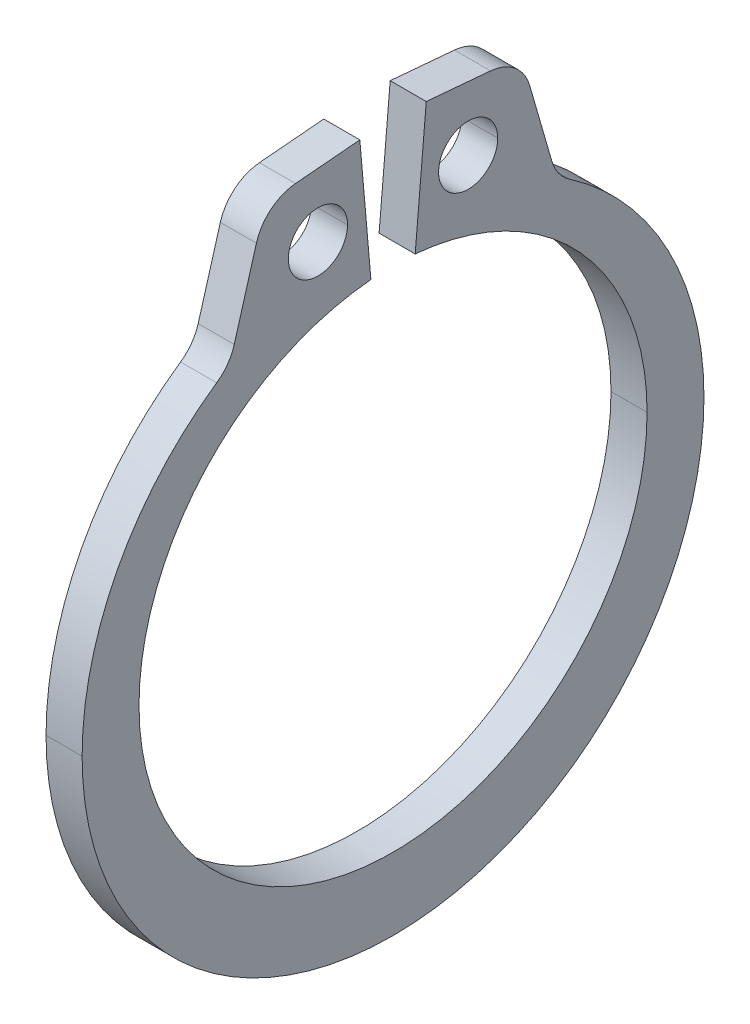
ISO-10303-21;
HEADER;
FILE_DESCRIPTION(('STEP AP214'),'2;1');
FILE_NAME('part.step','',(''),(''),'','','');
FILE_SCHEMA(('AUTOMOTIVE_DESIGN { 1 0 10303 214 1 1 1 1 }'));
ENDSEC;
DATA;
#1=APPLICATION_CONTEXT('core data for automotive mechanical design processes');
#2=APPLICATION_PROTOCOL_DEFINITION('international standard','automotive_design',2000,#1);
#3=PRODUCT_CONTEXT('',#1,'mechanical');
#4=PRODUCT('Part','Part','',(#3));
#5=PRODUCT_RELATED_PRODUCT_CATEGORY('part','',(#4));
#6=PRODUCT_DEFINITION_FORMATION('','',#4);
#7=PRODUCT_DEFINITION_CONTEXT('part definition',#1,'design');
#8=PRODUCT_DEFINITION('design','',#6,#7);
#9=PRODUCT_DEFINITION_SHAPE('','',#8);
#10=(LENGTH_UNIT() NAMED_UNIT(*) SI_UNIT(.MILLI.,.METRE.));
#11=(NAMED_UNIT(*) PLANE_ANGLE_UNIT() SI_UNIT($,.RADIAN.));
#12=(NAMED_UNIT(*) SI_UNIT($,.STERADIAN.) SOLID_ANGLE_UNIT());
#13=UNCERTAINTY_MEASURE_WITH_UNIT(LENGTH_MEASURE(1.E-05),#10,'distance_accuracy_value','');
#14=(GEOMETRIC_REPRESENTATION_CONTEXT(3) GLOBAL_UNCERTAINTY_ASSIGNED_CONTEXT((#13)) GLOBAL_UNIT_ASSIGNED_CONTEXT((#10,
#11,#12)) REPRESENTATION_CONTEXT('',''));
#15=CARTESIAN_POINT('',(0.,0.,0.));
#16=DIRECTION('',(0.,0.,1.));
#17=DIRECTION('',(1.,0.,0.));
#18=AXIS2_PLACEMENT_3D('',#15,#16,#17);
#19=CARTESIAN_POINT('',(0.3175,5.79662479241458,-1.64800517374158));
#20=DIRECTION('',(-1.,0.,0.));
#21=DIRECTION('',(0.,0.,1.));
#22=AXIS2_PLACEMENT_3D('',#19,#20,#21);
#23=CYLINDRICAL_SURFACE('',#22,0.7874);
#24=CARTESIAN_POINT('',(0.3175,5.79662479241458,-1.64800517374158));
#25=DIRECTION('',(1.,0.,0.));
#26=DIRECTION('',(0.,0.,-1.));
#27=AXIS2_PLACEMENT_3D('',#24,#25,#26);
#28=CIRCLE('',#27,0.7874);
#29=CARTESIAN_POINT('',(0.3175,6.0153466835661,-2.40441742531549));
#30=VERTEX_POINT('',#29);
#31=CARTESIAN_POINT('',(0.3175,6.58102849769201,-1.71663160558108));
#32=VERTEX_POINT('',#31);
#33=EDGE_CURVE('E198',#30,#32,#28,.T.);
#34=ORIENTED_EDGE('',*,*,#33,.F.);
#35=DIRECTION('',(1.,0.,0.));
#36=VECTOR('',#35,1.);
#37=CARTESIAN_POINT('',(0.3175,6.0153466835661,-2.40441742531549));
#38=LINE('',#37,#36);
#39=CARTESIAN_POINT('',(-0.3175,6.0153466835661,-2.40441742531549));
#40=VERTEX_POINT('',#39);
#41=EDGE_CURVE('E206',#40,#30,#38,.T.);
#42=ORIENTED_EDGE('',*,*,#41,.F.);
#43=CARTESIAN_POINT('',(-0.3175,5.79662479241458,-1.64800517374158));
#44=DIRECTION('',(-1.,0.,0.));
#45=DIRECTION('',(0.,0.,-1.));
#46=AXIS2_PLACEMENT_3D('',#43,#44,#45);
#47=CIRCLE('',#46,0.7874);
#48=CARTESIAN_POINT('',(-0.3175,6.58102849769201,-1.71663160558108));
#49=VERTEX_POINT('',#48);
#50=EDGE_CURVE('E201',#49,#40,#47,.T.);
#51=ORIENTED_EDGE('',*,*,#50,.F.);
#52=DIRECTION('',(-1.,0.,0.));
#53=VECTOR('',#52,1.);
#54=CARTESIAN_POINT('',(0.3175,6.58102849769201,-1.71663160558108));
#55=LINE('',#54,#53);
#56=EDGE_CURVE('E27',#32,#49,#55,.T.);
#57=ORIENTED_EDGE('',*,*,#56,.F.);
#58=EDGE_LOOP('',(#34,#42,#51,#57));
#59=FACE_BOUND('',#58,.T.);
#60=ADVANCED_FACE('F16',(#59),#23,.T.);
#61=CARTESIAN_POINT('',(0.3175,5.79662479241458,1.64800517374158));
#62=DIRECTION('',(-1.,0.,0.));
#63=DIRECTION('',(0.,0.,1.));
#64=AXIS2_PLACEMENT_3D('',#61,#62,#63);
#65=CYLINDRICAL_SURFACE('',#64,0.7874);
#66=CARTESIAN_POINT('',(0.3175,5.79662479241458,1.64800517374158));
#67=DIRECTION('',(1.,0.,0.));
#68=DIRECTION('',(0.,0.,-1.));
#69=AXIS2_PLACEMENT_3D('',#66,#67,#68);
#70=CIRCLE('',#69,0.7874);
#71=CARTESIAN_POINT('',(0.3175,6.58102849769201,1.71663160558108));
#72=VERTEX_POINT('',#71);
#73=CARTESIAN_POINT('',(0.3175,6.0153466835661,2.40441742531549));
#74=VERTEX_POINT('',#73);
#75=EDGE_CURVE('E256',#72,#74,#70,.T.);
#76=ORIENTED_EDGE('',*,*,#75,.F.);
#77=DIRECTION('',(1.,0.,0.));
#78=VECTOR('',#77,1.);
#79=CARTESIAN_POINT('',(0.3175,6.58102849769201,1.71663160558108));
#80=LINE('',#79,#78);
#81=CARTESIAN_POINT('',(-0.3175,6.58102849769201,1.71663160558108));
#82=VERTEX_POINT('',#81);
#83=EDGE_CURVE('E359',#82,#72,#80,.T.);
#84=ORIENTED_EDGE('',*,*,#83,.F.);
#85=CARTESIAN_POINT('',(-0.3175,5.79662479241458,1.64800517374158));
#86=DIRECTION('',(-1.,0.,0.));
#87=DIRECTION('',(0.,0.,-1.));
#88=AXIS2_PLACEMENT_3D('',#85,#86,#87);
#89=CIRCLE('',#88,0.7874);
#90=CARTESIAN_POINT('',(-0.3175,6.0153466835661,2.40441742531549));
#91=VERTEX_POINT('',#90);
#92=EDGE_CURVE('E243',#91,#82,#89,.T.);
#93=ORIENTED_EDGE('',*,*,#92,.F.);
#94=DIRECTION('',(-1.,0.,0.));
#95=VECTOR('',#94,1.);
#96=CARTESIAN_POINT('',(0.3175,6.0153466835661,2.40441742531549));
#97=LINE('',#96,#95);
#98=EDGE_CURVE('E285',#74,#91,#97,.T.);
#99=ORIENTED_EDGE('',*,*,#98,.F.);
#100=EDGE_LOOP('',(#76,#84,#93,#99));
#101=FACE_BOUND('',#100,.T.);
#102=ADVANCED_FACE('F459',(#101),#65,.T.);
#103=CARTESIAN_POINT('',(0.3175,4.88597161021526,-3.55064133966726));
#104=DIRECTION('',(-1.,0.,0.));
#105=DIRECTION('',(0.,0.,1.));
#106=AXIS2_PLACEMENT_3D('',#103,#104,#105);
#107=CYLINDRICAL_SURFACE('',#106,0.7874);
#108=CARTESIAN_POINT('',(0.3175,4.88597161021526,-3.55064133966726));
#109=DIRECTION('',(-1.,0.,0.));
#110=DIRECTION('',(0.,0.,-1.));
#111=AXIS2_PLACEMENT_3D('',#108,#109,#110);
#112=CIRCLE('',#111,0.7874);
#113=CARTESIAN_POINT('',(0.3175,4.23752329507568,-3.1039719512012));
#114=VERTEX_POINT('',#113);
#115=CARTESIAN_POINT('',(0.3175,4.66724971906374,-2.79422908809336));
#116=VERTEX_POINT('',#115);
#117=EDGE_CURVE('E228',#114,#116,#112,.T.);
#118=ORIENTED_EDGE('',*,*,#117,.F.);
#119=DIRECTION('',(1.,0.,0.));
#120=VECTOR('',#119,1.);
#121=CARTESIAN_POINT('',(0.3175,4.23752329507568,-3.1039719512012));
#122=LINE('',#121,#120);
#123=CARTESIAN_POINT('',(-0.3175,4.23752329507568,-3.1039719512012));
#124=VERTEX_POINT('',#123);
#125=EDGE_CURVE('E284',#124,#114,#122,.T.);
#126=ORIENTED_EDGE('',*,*,#125,.F.);
#127=CARTESIAN_POINT('',(-0.3175,4.88597161021526,-3.55064133966726));
#128=DIRECTION('',(1.,0.,0.));
#129=DIRECTION('',(0.,0.,-1.));
#130=AXIS2_PLACEMENT_3D('',#127,#128,#129);
#131=CIRCLE('',#130,0.7874);
#132=CARTESIAN_POINT('',(-0.3175,4.66724971906374,-2.79422908809336));
#133=VERTEX_POINT('',#132);
#134=EDGE_CURVE('E323',#133,#124,#131,.T.);
#135=ORIENTED_EDGE('',*,*,#134,.F.);
#136=DIRECTION('',(-1.,0.,0.));
#137=VECTOR('',#136,1.);
#138=CARTESIAN_POINT('',(-0.3175,4.66724971906374,-2.79422908809336));
#139=LINE('',#138,#137);
#140=EDGE_CURVE('E248',#116,#133,#139,.T.);
#141=ORIENTED_EDGE('',*,*,#140,.F.);
#142=EDGE_LOOP('',(#118,#126,#135,#141));
#143=FACE_BOUND('',#142,.T.);
#144=ADVANCED_FACE('F487',(#143),#107,.F.);
#145=CARTESIAN_POINT('',(0.3175,4.88597161021526,3.55064133966726));
#146=DIRECTION('',(-1.,0.,0.));
#147=DIRECTION('',(0.,0.,1.));
#148=AXIS2_PLACEMENT_3D('',#145,#146,#147);
#149=CYLINDRICAL_SURFACE('',#148,0.7874);
#150=CARTESIAN_POINT('',(0.3175,4.88597161021526,3.55064133966726));
#151=DIRECTION('',(-1.,0.,0.));
#152=DIRECTION('',(0.,0.,-1.));
#153=AXIS2_PLACEMENT_3D('',#150,#151,#152);
#154=CIRCLE('',#153,0.7874);
#155=CARTESIAN_POINT('',(0.3175,4.66724971906374,2.79422908809336));
#156=VERTEX_POINT('',#155);
#157=CARTESIAN_POINT('',(0.3175,4.23752329507568,3.1039719512012));
#158=VERTEX_POINT('',#157);
#159=EDGE_CURVE('E255',#156,#158,#154,.T.);
#160=ORIENTED_EDGE('',*,*,#159,.F.);
#161=DIRECTION('',(1.,0.,0.));
#162=VECTOR('',#161,1.);
#163=CARTESIAN_POINT('',(0.3175,4.66724971906374,2.79422908809336));
#164=LINE('',#163,#162);
#165=CARTESIAN_POINT('',(-0.3175,4.66724971906374,2.79422908809336));
#166=VERTEX_POINT('',#165);
#167=EDGE_CURVE('E288',#166,#156,#164,.T.);
#168=ORIENTED_EDGE('',*,*,#167,.F.);
#169=CARTESIAN_POINT('',(-0.3175,4.88597161021526,3.55064133966726));
#170=DIRECTION('',(1.,0.,0.));
#171=DIRECTION('',(0.,0.,-1.));
#172=AXIS2_PLACEMENT_3D('',#169,#170,#171);
#173=CIRCLE('',#172,0.7874);
#174=CARTESIAN_POINT('',(-0.3175,4.23752329507568,3.1039719512012));
#175=VERTEX_POINT('',#174);
#176=EDGE_CURVE('E322',#175,#166,#173,.T.);
#177=ORIENTED_EDGE('',*,*,#176,.F.);
#178=DIRECTION('',(-1.,0.,0.));
#179=VECTOR('',#178,1.);
#180=CARTESIAN_POINT('',(0.3175,4.23752329507568,3.1039719512012));
#181=LINE('',#180,#179);
#182=EDGE_CURVE('E42',#158,#175,#181,.T.);
#183=ORIENTED_EDGE('',*,*,#182,.F.);
#184=EDGE_LOOP('',(#160,#168,#177,#183));
#185=FACE_BOUND('',#184,.T.);
#186=ADVANCED_FACE('F498',(#185),#149,.F.);
#187=CARTESIAN_POINT('',(0.3175,5.49368202936558,-1.32203668641442));
#188=DIRECTION('',(-1.,0.,0.));
#189=DIRECTION('',(0.,0.,1.));
#190=AXIS2_PLACEMENT_3D('',#187,#188,#189);
#191=CYLINDRICAL_SURFACE('',#190,0.5207);
#192=DIRECTION('',(-1.,0.,0.));
#193=VECTOR('',#192,1.);
#194=CARTESIAN_POINT('',(0.3175,5.49368202936558,-1.84273668641442));
#195=LINE('',#194,#193);
#196=CARTESIAN_POINT('',(0.3175,5.49368202936558,-1.84273668641442));
#197=VERTEX_POINT('',#196);
#198=CARTESIAN_POINT('',(-0.3175,5.49368202936558,-1.84273668641442));
#199=VERTEX_POINT('',#198);
#200=EDGE_CURVE('E381',#197,#199,#195,.T.);
#201=ORIENTED_EDGE('',*,*,#200,.F.);
#202=CARTESIAN_POINT('',(0.3175,5.49368202936558,-1.32203668641442));
#203=DIRECTION('',(1.,0.,0.));
#204=DIRECTION('',(0.,0.,-1.));
#205=AXIS2_PLACEMENT_3D('',#202,#203,#204);
#206=CIRCLE('',#205,0.5207);
#207=CARTESIAN_POINT('',(0.3175,5.49368202936558,-0.801336686414417));
#208=VERTEX_POINT('',#207);
#209=EDGE_CURVE('E244',#197,#208,#206,.T.);
#210=ORIENTED_EDGE('',*,*,#209,.T.);
#211=DIRECTION('',(-1.,0.,0.));
#212=VECTOR('',#211,1.);
#213=CARTESIAN_POINT('',(0.3175,5.49368202936558,-0.801336686414417));
#214=LINE('',#213,#212);
#215=CARTESIAN_POINT('',(-0.3175,5.49368202936558,-0.801336686414417));
#216=VERTEX_POINT('',#215);
#217=EDGE_CURVE('E294',#208,#216,#214,.T.);
#218=ORIENTED_EDGE('',*,*,#217,.T.);
#219=CARTESIAN_POINT('',(-0.3175,5.49368202936558,-1.32203668641442));
#220=DIRECTION('',(1.,0.,0.));
#221=DIRECTION('',(0.,0.,-1.));
#222=AXIS2_PLACEMENT_3D('',#219,#220,#221);
#223=CIRCLE('',#222,0.5207);
#224=EDGE_CURVE('E251',#199,#216,#223,.T.);
#225=ORIENTED_EDGE('',*,*,#224,.F.);
#226=EDGE_LOOP('',(#201,#210,#218,#225));
#227=FACE_BOUND('',#226,.T.);
#228=ADVANCED_FACE('F442',(#227),#191,.F.);
#229=CARTESIAN_POINT('',(0.3175,5.49368202936558,1.32203668641442));
#230=DIRECTION('',(-1.,0.,0.));
#231=DIRECTION('',(0.,0.,1.));
#232=AXIS2_PLACEMENT_3D('',#229,#230,#231);
#233=CYLINDRICAL_SURFACE('',#232,0.5207);
#234=DIRECTION('',(-1.,0.,0.));
#235=VECTOR('',#234,1.);
#236=CARTESIAN_POINT('',(0.3175,5.49368202936558,0.801336686414417));
#237=LINE('',#236,#235);
#238=CARTESIAN_POINT('',(0.3175,5.49368202936558,0.801336686414417));
#239=VERTEX_POINT('',#238);
#240=CARTESIAN_POINT('',(-0.3175,5.49368202936558,0.801336686414417));
#241=VERTEX_POINT('',#240);
#242=EDGE_CURVE('E293',#239,#241,#237,.T.);
#243=ORIENTED_EDGE('',*,*,#242,.F.);
#244=CARTESIAN_POINT('',(0.3175,5.49368202936558,1.32203668641442));
#245=DIRECTION('',(1.,0.,0.));
#246=DIRECTION('',(0.,0.,-1.));
#247=AXIS2_PLACEMENT_3D('',#244,#245,#246);
#248=CIRCLE('',#247,0.5207);
#249=CARTESIAN_POINT('',(0.3175,5.49368202936558,1.84273668641442));
#250=VERTEX_POINT('',#249);
#251=EDGE_CURVE('E238',#239,#250,#248,.T.);
#252=ORIENTED_EDGE('',*,*,#251,.T.);
#253=DIRECTION('',(-1.,0.,0.));
#254=VECTOR('',#253,1.);
#255=CARTESIAN_POINT('',(0.3175,5.49368202936558,1.84273668641442));
#256=LINE('',#255,#254);
#257=CARTESIAN_POINT('',(-0.3175,5.49368202936558,1.84273668641442));
#258=VERTEX_POINT('',#257);
#259=EDGE_CURVE('E300',#250,#258,#256,.T.);
#260=ORIENTED_EDGE('',*,*,#259,.T.);
#261=CARTESIAN_POINT('',(-0.3175,5.49368202936558,1.32203668641442));
#262=DIRECTION('',(1.,0.,0.));
#263=DIRECTION('',(0.,0.,-1.));
#264=AXIS2_PLACEMENT_3D('',#261,#262,#263);
#265=CIRCLE('',#264,0.5207);
#266=EDGE_CURVE('E357',#241,#258,#265,.T.);
#267=ORIENTED_EDGE('',*,*,#266,.F.);
#268=EDGE_LOOP('',(#243,#252,#260,#267));
#269=FACE_BOUND('',#268,.T.);
#270=ADVANCED_FACE('F506',(#269),#233,.F.);
#271=CARTESIAN_POINT('',(0.3175,4.45338877834933,-0.389621032379134));
#272=DIRECTION('',(0.,-0.0871557427476585,-0.996194698091745));
#273=DIRECTION('',(0.,-0.996194698091745,0.0871557427476585));
#274=AXIS2_PLACEMENT_3D('',#271,#272,#273);
#275=PLANE('',#274);
#276=DIRECTION('',(0.,-0.996194698091746,0.0871557427476585));
#277=VECTOR('',#276,1.);
#278=CARTESIAN_POINT('',(-0.3175,4.45338877834933,-0.389621032379134));
#279=LINE('',#278,#277);
#280=CARTESIAN_POINT('',(-0.3175,6.68008316752401,-0.584431548568701));
#281=VERTEX_POINT('',#280);
#282=CARTESIAN_POINT('',(-0.3175,4.45338877834933,-0.389621032379134));
#283=VERTEX_POINT('',#282);
#284=EDGE_CURVE('E365',#281,#283,#279,.T.);
#285=ORIENTED_EDGE('',*,*,#284,.T.);
#286=DIRECTION('',(-1.,0.,0.));
#287=VECTOR('',#286,1.);
#288=CARTESIAN_POINT('',(0.3175,4.45338877834933,-0.389621032379134));
#289=LINE('',#288,#287);
#290=CARTESIAN_POINT('',(0.3175,4.45338877834933,-0.389621032379134));
#291=VERTEX_POINT('',#290);
#292=EDGE_CURVE('E249',#291,#283,#289,.T.);
#293=ORIENTED_EDGE('',*,*,#292,.F.);
#294=DIRECTION('',(0.,-0.996194698091746,0.0871557427476585));
#295=VECTOR('',#294,1.);
#296=CARTESIAN_POINT('',(0.3175,4.45338877834933,-0.389621032379134));
#297=LINE('',#296,#295);
#298=CARTESIAN_POINT('',(0.3175,6.68008316752401,-0.584431548568701));
#299=VERTEX_POINT('',#298);
#300=EDGE_CURVE('E215',#299,#291,#297,.T.);
#301=ORIENTED_EDGE('',*,*,#300,.F.);
#302=DIRECTION('',(-1.,0.,0.));
#303=VECTOR('',#302,1.);
#304=CARTESIAN_POINT('',(0.3175,6.68008316752401,-0.584431548568701));
#305=LINE('',#304,#303);
#306=EDGE_CURVE('E11',#299,#281,#305,.T.);
#307=ORIENTED_EDGE('',*,*,#306,.T.);
#308=EDGE_LOOP('',(#285,#293,#301,#307));
#309=FACE_BOUND('',#308,.T.);
#310=ADVANCED_FACE('F18',(#309),#275,.F.);
#311=CARTESIAN_POINT('',(0.3175,6.68008316752401,-0.584431548568701));
#312=DIRECTION('',(0.,-0.996194698091746,0.0871557427476583));
#313=DIRECTION('',(-1.,0.,0.));
#314=AXIS2_PLACEMENT_3D('',#311,#312,#313);
#315=PLANE('',#314);
#316=DIRECTION('',(0.,0.0871557427476583,0.996194698091746));
#317=VECTOR('',#316,1.);
#318=CARTESIAN_POINT('',(0.3175,6.68008316752401,-0.584431548568701));
#319=LINE('',#318,#317);
#320=EDGE_CURVE('E209',#32,#299,#319,.T.);
#321=ORIENTED_EDGE('',*,*,#320,.F.);
#322=ORIENTED_EDGE('',*,*,#56,.T.);
#323=DIRECTION('',(0.,0.0871557427476583,0.996194698091746));
#324=VECTOR('',#323,1.);
#325=CARTESIAN_POINT('',(-0.3175,6.68008316752401,-0.584431548568701));
#326=LINE('',#325,#324);
#327=EDGE_CURVE('E362',#49,#281,#326,.T.);
#328=ORIENTED_EDGE('',*,*,#327,.T.);
#329=ORIENTED_EDGE('',*,*,#306,.F.);
#330=EDGE_LOOP('',(#321,#322,#328,#329));
#331=FACE_BOUND('',#330,.T.);
#332=ADVANCED_FACE('F210',(#331),#315,.F.);
#333=CARTESIAN_POINT('',(0.3175,6.53397528038184,-2.2544523404497));
#334=DIRECTION('',(0.,-0.277777357317143,0.96064548078982));
#335=DIRECTION('',(-1.,0.,0.));
#336=AXIS2_PLACEMENT_3D('',#333,#334,#335);
#337=PLANE('',#336);
#338=DIRECTION('',(0.,0.96064548078982,0.277777357317143));
#339=VECTOR('',#338,1.);
#340=CARTESIAN_POINT('',(0.3175,6.53397528038184,-2.2544523404497));
#341=LINE('',#340,#339);
#342=EDGE_CURVE('E221',#116,#30,#341,.T.);
#343=ORIENTED_EDGE('',*,*,#342,.F.);
#344=ORIENTED_EDGE('',*,*,#140,.T.);
#345=DIRECTION('',(0.,0.96064548078982,0.277777357317143));
#346=VECTOR('',#345,1.);
#347=CARTESIAN_POINT('',(-0.3175,6.53397528038184,-2.2544523404497));
#348=LINE('',#347,#346);
#349=EDGE_CURVE('E368',#133,#40,#348,.T.);
#350=ORIENTED_EDGE('',*,*,#349,.T.);
#351=ORIENTED_EDGE('',*,*,#41,.T.);
#352=EDGE_LOOP('',(#343,#344,#350,#351));
#353=FACE_BOUND('',#352,.T.);
#354=ADVANCED_FACE('F485',(#353),#337,.F.);
#355=CARTESIAN_POINT('',(0.3175,-0.268640399976456,0.));
#356=DIRECTION('',(-1.,0.,0.));
#357=DIRECTION('',(0.,0.,1.));
#358=AXIS2_PLACEMENT_3D('',#355,#356,#357);
#359=CYLINDRICAL_SURFACE('',#358,5.47175960002354);
#360=DIRECTION('',(-1.,0.,0.));
#361=VECTOR('',#360,1.);
#362=CARTESIAN_POINT('',(0.3175,-0.268640399976456,5.47175960002354));
#363=LINE('',#362,#361);
#364=CARTESIAN_POINT('',(0.3175,-0.268640399976456,5.47175960002354));
#365=VERTEX_POINT('',#364);
#366=CARTESIAN_POINT('',(-0.3175,-0.268640399976456,5.47175960002354));
#367=VERTEX_POINT('',#366);
#368=EDGE_CURVE('E283',#365,#367,#363,.T.);
#369=ORIENTED_EDGE('',*,*,#368,.F.);
#370=CARTESIAN_POINT('',(0.3175,-0.268640399976456,0.));
#371=DIRECTION('',(1.,0.,0.));
#372=DIRECTION('',(0.,0.,-1.));
#373=AXIS2_PLACEMENT_3D('',#370,#371,#372);
#374=CIRCLE('',#373,5.47175960002354);
#375=EDGE_CURVE('E264',#158,#365,#374,.T.);
#376=ORIENTED_EDGE('',*,*,#375,.F.);
#377=ORIENTED_EDGE('',*,*,#182,.T.);
#378=CARTESIAN_POINT('',(-0.3175,-0.268640399976456,0.));
#379=DIRECTION('',(1.,0.,0.));
#380=DIRECTION('',(0.,0.,-1.));
#381=AXIS2_PLACEMENT_3D('',#378,#379,#380);
#382=CIRCLE('',#381,5.47175960002354);
#383=EDGE_CURVE('E319',#175,#367,#382,.T.);
#384=ORIENTED_EDGE('',*,*,#383,.T.);
#385=EDGE_LOOP('',(#369,#376,#377,#384));
#386=FACE_BOUND('',#385,.T.);
#387=ADVANCED_FACE('F496',(#386),#359,.T.);
#388=CARTESIAN_POINT('',(0.3175,6.53397528038184,2.2544523404497));
#389=DIRECTION('',(0.,-0.277777357317143,-0.96064548078982));
#390=DIRECTION('',(0.,-0.96064548078982,0.277777357317143));
#391=AXIS2_PLACEMENT_3D('',#388,#389,#390);
#392=PLANE('',#391);
#393=DIRECTION('',(0.,-0.96064548078982,0.277777357317143));
#394=VECTOR('',#393,1.);
#395=CARTESIAN_POINT('',(-0.3175,6.53397528038184,2.2544523404497));
#396=LINE('',#395,#394);
#397=EDGE_CURVE('E240',#91,#166,#396,.T.);
#398=ORIENTED_EDGE('',*,*,#397,.T.);
#399=ORIENTED_EDGE('',*,*,#167,.T.);
#400=DIRECTION('',(0.,-0.96064548078982,0.277777357317143));
#401=VECTOR('',#400,1.);
#402=CARTESIAN_POINT('',(0.3175,6.53397528038184,2.2544523404497));
#403=LINE('',#402,#401);
#404=EDGE_CURVE('E252',#74,#156,#403,.T.);
#405=ORIENTED_EDGE('',*,*,#404,.F.);
#406=ORIENTED_EDGE('',*,*,#98,.T.);
#407=EDGE_LOOP('',(#398,#399,#405,#406));
#408=FACE_BOUND('',#407,.T.);
#409=ADVANCED_FACE('F456',(#408),#392,.F.);
#410=CARTESIAN_POINT('',(0.3175,6.68008316752401,0.584431548568701));
#411=DIRECTION('',(0.,-0.996194698091746,-0.0871557427476583));
#412=DIRECTION('',(0.,0.0871557427476583,-0.996194698091746));
#413=AXIS2_PLACEMENT_3D('',#410,#411,#412);
#414=PLANE('',#413);
#415=DIRECTION('',(0.,-0.0871557427476583,0.996194698091746));
#416=VECTOR('',#415,1.);
#417=CARTESIAN_POINT('',(-0.3175,6.68008316752401,0.584431548568701));
#418=LINE('',#417,#416);
#419=CARTESIAN_POINT('',(-0.3175,6.68008316752401,0.584431548568701));
#420=VERTEX_POINT('',#419);
#421=EDGE_CURVE('E309',#420,#82,#418,.T.);
#422=ORIENTED_EDGE('',*,*,#421,.T.);
#423=ORIENTED_EDGE('',*,*,#83,.T.);
#424=DIRECTION('',(0.,-0.0871557427476583,0.996194698091746));
#425=VECTOR('',#424,1.);
#426=CARTESIAN_POINT('',(0.3175,6.68008316752401,0.584431548568701));
#427=LINE('',#426,#425);
#428=CARTESIAN_POINT('',(0.3175,6.68008316752401,0.584431548568701));
#429=VERTEX_POINT('',#428);
#430=EDGE_CURVE('E266',#429,#72,#427,.T.);
#431=ORIENTED_EDGE('',*,*,#430,.F.);
#432=DIRECTION('',(-1.,0.,0.));
#433=VECTOR('',#432,1.);
#434=CARTESIAN_POINT('',(0.3175,6.68008316752401,0.584431548568701));
#435=LINE('',#434,#433);
#436=EDGE_CURVE('E20',#429,#420,#435,.T.);
#437=ORIENTED_EDGE('',*,*,#436,.T.);
#438=EDGE_LOOP('',(#422,#423,#431,#437));
#439=FACE_BOUND('',#438,.T.);
#440=ADVANCED_FACE('F462',(#439),#414,.F.);
#441=CARTESIAN_POINT('',(0.3175,4.45338877834933,0.389621032379134));
#442=DIRECTION('',(0.,-0.0871557427476585,0.996194698091745));
#443=DIRECTION('',(-1.,0.,0.));
#444=AXIS2_PLACEMENT_3D('',#441,#442,#443);
#445=PLANE('',#444);
#446=DIRECTION('',(0.,0.996194698091746,0.0871557427476585));
#447=VECTOR('',#446,1.);
#448=CARTESIAN_POINT('',(-0.3175,4.45338877834933,0.389621032379134));
#449=LINE('',#448,#447);
#450=CARTESIAN_POINT('',(-0.3175,4.45338877834933,0.389621032379134));
#451=VERTEX_POINT('',#450);
#452=EDGE_CURVE('E313',#451,#420,#449,.T.);
#453=ORIENTED_EDGE('',*,*,#452,.T.);
#454=ORIENTED_EDGE('',*,*,#436,.F.);
#455=DIRECTION('',(0.,0.996194698091746,0.0871557427476585));
#456=VECTOR('',#455,1.);
#457=CARTESIAN_POINT('',(0.3175,4.45338877834933,0.389621032379134));
#458=LINE('',#457,#456);
#459=CARTESIAN_POINT('',(0.3175,4.45338877834933,0.389621032379134));
#460=VERTEX_POINT('',#459);
#461=EDGE_CURVE('E234',#460,#429,#458,.T.);
#462=ORIENTED_EDGE('',*,*,#461,.F.);
#463=DIRECTION('',(-1.,0.,0.));
#464=VECTOR('',#463,1.);
#465=CARTESIAN_POINT('',(0.3175,4.45338877834933,0.389621032379134));
#466=LINE('',#465,#464);
#467=EDGE_CURVE('E232',#460,#451,#466,.T.);
#468=ORIENTED_EDGE('',*,*,#467,.T.);
#469=EDGE_LOOP('',(#453,#454,#462,#468));
#470=FACE_BOUND('',#469,.T.);
#471=ADVANCED_FACE('F468',(#470),#445,.F.);
#472=CARTESIAN_POINT('',(0.3175,0.,0.));
#473=DIRECTION('',(-1.,0.,0.));
#474=DIRECTION('',(0.,0.,1.));
#475=AXIS2_PLACEMENT_3D('',#472,#473,#474);
#476=CYLINDRICAL_SURFACE('',#475,4.4704);
#477=DIRECTION('',(-1.,0.,0.));
#478=VECTOR('',#477,1.);
#479=CARTESIAN_POINT('',(0.3175,0.,-4.4704));
#480=LINE('',#479,#478);
#481=CARTESIAN_POINT('',(0.3175,0.,-4.4704));
#482=VERTEX_POINT('',#481);
#483=CARTESIAN_POINT('',(-0.3175,0.,-4.4704));
#484=VERTEX_POINT('',#483);
#485=EDGE_CURVE('E274',#482,#484,#480,.T.);
#486=ORIENTED_EDGE('',*,*,#485,.F.);
#487=CARTESIAN_POINT('',(0.3175,0.,0.));
#488=DIRECTION('',(-1.,0.,0.));
#489=DIRECTION('',(0.,0.,-1.));
#490=AXIS2_PLACEMENT_3D('',#487,#488,#489);
#491=CIRCLE('',#490,4.4704);
#492=EDGE_CURVE('E239',#291,#482,#491,.T.);
#493=ORIENTED_EDGE('',*,*,#492,.F.);
#494=ORIENTED_EDGE('',*,*,#292,.T.);
#495=CARTESIAN_POINT('',(-0.3175,0.,0.));
#496=DIRECTION('',(-1.,0.,0.));
#497=DIRECTION('',(0.,0.,-1.));
#498=AXIS2_PLACEMENT_3D('',#495,#496,#497);
#499=CIRCLE('',#498,4.4704);
#500=EDGE_CURVE('E408',#283,#484,#499,.T.);
#501=ORIENTED_EDGE('',*,*,#500,.T.);
#502=EDGE_LOOP('',(#486,#493,#494,#501));
#503=FACE_BOUND('',#502,.T.);
#504=ADVANCED_FACE('F447',(#503),#476,.F.);
#505=CARTESIAN_POINT('',(-0.3175,0.,0.));
#506=DIRECTION('',(1.,0.,0.));
#507=DIRECTION('',(0.,1.,0.));
#508=AXIS2_PLACEMENT_3D('',#505,#506,#507);
#509=PLANE('',#508);
#510=CARTESIAN_POINT('',(-0.3175,5.49368202936558,-1.32203668641442));
#511=DIRECTION('',(1.,0.,0.));
#512=DIRECTION('',(0.,0.,-1.));
#513=AXIS2_PLACEMENT_3D('',#510,#511,#512);
#514=CIRCLE('',#513,0.5207);
#515=EDGE_CURVE('E378',#216,#199,#514,.T.);
#516=ORIENTED_EDGE('',*,*,#515,.T.);
#517=ORIENTED_EDGE('',*,*,#224,.T.);
#518=EDGE_LOOP('',(#516,#517));
#519=FACE_BOUND('',#518,.T.);
#520=CARTESIAN_POINT('',(-0.3175,5.49368202936558,1.32203668641442));
#521=DIRECTION('',(1.,0.,0.));
#522=DIRECTION('',(0.,0.,-1.));
#523=AXIS2_PLACEMENT_3D('',#520,#521,#522);
#524=CIRCLE('',#523,0.5207);
#525=EDGE_CURVE('E343',#258,#241,#524,.T.);
#526=ORIENTED_EDGE('',*,*,#525,.T.);
#527=ORIENTED_EDGE('',*,*,#266,.T.);
#528=EDGE_LOOP('',(#526,#527));
#529=FACE_BOUND('',#528,.T.);
#530=ORIENTED_EDGE('',*,*,#397,.F.);
#531=ORIENTED_EDGE('',*,*,#92,.T.);
#532=ORIENTED_EDGE('',*,*,#421,.F.);
#533=ORIENTED_EDGE('',*,*,#452,.F.);
#534=CARTESIAN_POINT('',(-0.3175,0.,0.));
#535=DIRECTION('',(-1.,0.,0.));
#536=DIRECTION('',(0.,0.,-1.));
#537=AXIS2_PLACEMENT_3D('',#534,#535,#536);
#538=CIRCLE('',#537,4.4704);
#539=CARTESIAN_POINT('',(-0.3175,0.,4.4704));
#540=VERTEX_POINT('',#539);
#541=EDGE_CURVE('E330',#540,#451,#538,.T.);
#542=ORIENTED_EDGE('',*,*,#541,.F.);
#543=CARTESIAN_POINT('',(-0.3175,0.,0.));
#544=DIRECTION('',(-1.,0.,0.));
#545=DIRECTION('',(0.,0.,-1.));
#546=AXIS2_PLACEMENT_3D('',#543,#544,#545);
#547=CIRCLE('',#546,4.4704);
#548=EDGE_CURVE('E278',#484,#540,#547,.T.);
#549=ORIENTED_EDGE('',*,*,#548,.F.);
#550=ORIENTED_EDGE('',*,*,#500,.F.);
#551=ORIENTED_EDGE('',*,*,#284,.F.);
#552=ORIENTED_EDGE('',*,*,#327,.F.);
#553=ORIENTED_EDGE('',*,*,#50,.T.);
#554=ORIENTED_EDGE('',*,*,#349,.F.);
#555=ORIENTED_EDGE('',*,*,#134,.T.);
#556=CARTESIAN_POINT('',(-0.3175,-0.268640399976456,0.));
#557=DIRECTION('',(1.,0.,0.));
#558=DIRECTION('',(0.,0.,-1.));
#559=AXIS2_PLACEMENT_3D('',#556,#557,#558);
#560=CIRCLE('',#559,5.47175960002354);
#561=CARTESIAN_POINT('',(-0.3175,-0.268640399976454,-5.47175960002354));
#562=VERTEX_POINT('',#561);
#563=EDGE_CURVE('E301',#562,#124,#560,.T.);
#564=ORIENTED_EDGE('',*,*,#563,.F.);
#565=CARTESIAN_POINT('',(-0.3175,-0.268640399976456,0.));
#566=DIRECTION('',(1.,0.,0.));
#567=DIRECTION('',(0.,0.,-1.));
#568=AXIS2_PLACEMENT_3D('',#565,#566,#567);
#569=CIRCLE('',#568,5.47175960002354);
#570=EDGE_CURVE('E308',#367,#562,#569,.T.);
#571=ORIENTED_EDGE('',*,*,#570,.F.);
#572=ORIENTED_EDGE('',*,*,#383,.F.);
#573=ORIENTED_EDGE('',*,*,#176,.T.);
#574=EDGE_LOOP('',(#530,#531,#532,#533,#542,#549,#550,#551,#552,#553,#554,#555,#564,#571,#572,#573));
#575=FACE_BOUND('',#574,.T.);
#576=ADVANCED_FACE('F444',(#519,#529,#575),#509,.F.);
#577=CARTESIAN_POINT('',(0.3175,0.,0.));
#578=DIRECTION('',(1.,0.,0.));
#579=DIRECTION('',(0.,1.,0.));
#580=AXIS2_PLACEMENT_3D('',#577,#578,#579);
#581=PLANE('',#580);
#582=CARTESIAN_POINT('',(0.3175,5.49368202936558,-1.32203668641442));
#583=DIRECTION('',(1.,0.,0.));
#584=DIRECTION('',(0.,0.,-1.));
#585=AXIS2_PLACEMENT_3D('',#582,#583,#584);
#586=CIRCLE('',#585,0.5207);
#587=EDGE_CURVE('E385',#208,#197,#586,.T.);
#588=ORIENTED_EDGE('',*,*,#587,.F.);
#589=ORIENTED_EDGE('',*,*,#209,.F.);
#590=EDGE_LOOP('',(#588,#589));
#591=FACE_BOUND('',#590,.T.);
#592=CARTESIAN_POINT('',(0.3175,5.49368202936558,1.32203668641442));
#593=DIRECTION('',(1.,0.,0.));
#594=DIRECTION('',(0.,0.,-1.));
#595=AXIS2_PLACEMENT_3D('',#592,#593,#594);
#596=CIRCLE('',#595,0.5207);
#597=EDGE_CURVE('E289',#250,#239,#596,.T.);
#598=ORIENTED_EDGE('',*,*,#597,.F.);
#599=ORIENTED_EDGE('',*,*,#251,.F.);
#600=EDGE_LOOP('',(#598,#599));
#601=FACE_BOUND('',#600,.T.);
#602=ORIENTED_EDGE('',*,*,#430,.T.);
#603=ORIENTED_EDGE('',*,*,#75,.T.);
#604=ORIENTED_EDGE('',*,*,#404,.T.);
#605=ORIENTED_EDGE('',*,*,#159,.T.);
#606=ORIENTED_EDGE('',*,*,#375,.T.);
#607=CARTESIAN_POINT('',(0.3175,-0.268640399976456,0.));
#608=DIRECTION('',(1.,0.,0.));
#609=DIRECTION('',(0.,0.,-1.));
#610=AXIS2_PLACEMENT_3D('',#607,#608,#609);
#611=CIRCLE('',#610,5.47175960002354);
#612=CARTESIAN_POINT('',(0.3175,-0.268640399976454,-5.47175960002354));
#613=VERTEX_POINT('',#612);
#614=EDGE_CURVE('E280',#365,#613,#611,.T.);
#615=ORIENTED_EDGE('',*,*,#614,.T.);
#616=CARTESIAN_POINT('',(0.3175,-0.268640399976456,0.));
#617=DIRECTION('',(1.,0.,0.));
#618=DIRECTION('',(0.,0.,-1.));
#619=AXIS2_PLACEMENT_3D('',#616,#617,#618);
#620=CIRCLE('',#619,5.47175960002354);
#621=EDGE_CURVE('E295',#613,#114,#620,.T.);
#622=ORIENTED_EDGE('',*,*,#621,.T.);
#623=ORIENTED_EDGE('',*,*,#117,.T.);
#624=ORIENTED_EDGE('',*,*,#342,.T.);
#625=ORIENTED_EDGE('',*,*,#33,.T.);
#626=ORIENTED_EDGE('',*,*,#320,.T.);
#627=ORIENTED_EDGE('',*,*,#300,.T.);
#628=ORIENTED_EDGE('',*,*,#492,.T.);
#629=CARTESIAN_POINT('',(0.3175,0.,0.));
#630=DIRECTION('',(-1.,0.,0.));
#631=DIRECTION('',(0.,0.,-1.));
#632=AXIS2_PLACEMENT_3D('',#629,#630,#631);
#633=CIRCLE('',#632,4.4704);
#634=CARTESIAN_POINT('',(0.3175,0.,4.4704));
#635=VERTEX_POINT('',#634);
#636=EDGE_CURVE('E279',#482,#635,#633,.T.);
#637=ORIENTED_EDGE('',*,*,#636,.T.);
#638=CARTESIAN_POINT('',(0.3175,0.,0.));
#639=DIRECTION('',(-1.,0.,0.));
#640=DIRECTION('',(0.,0.,-1.));
#641=AXIS2_PLACEMENT_3D('',#638,#639,#640);
#642=CIRCLE('',#641,4.4704);
#643=EDGE_CURVE('E326',#635,#460,#642,.T.);
#644=ORIENTED_EDGE('',*,*,#643,.T.);
#645=ORIENTED_EDGE('',*,*,#461,.T.);
#646=EDGE_LOOP('',(#602,#603,#604,#605,#606,#615,#622,#623,#624,#625,#626,#627,#628,#637,#644,#645));
#647=FACE_BOUND('',#646,.T.);
#648=ADVANCED_FACE('F218',(#591,#601,#647),#581,.T.);
#649=CARTESIAN_POINT('',(0.3175,0.,0.));
#650=DIRECTION('',(-1.,0.,0.));
#651=DIRECTION('',(0.,0.,1.));
#652=AXIS2_PLACEMENT_3D('',#649,#650,#651);
#653=CYLINDRICAL_SURFACE('',#652,4.4704);
#654=ORIENTED_EDGE('',*,*,#643,.F.);
#655=DIRECTION('',(-1.,0.,0.));
#656=VECTOR('',#655,1.);
#657=CARTESIAN_POINT('',(0.3175,0.,4.4704));
#658=LINE('',#657,#656);
#659=EDGE_CURVE('E331',#635,#540,#658,.T.);
#660=ORIENTED_EDGE('',*,*,#659,.T.);
#661=ORIENTED_EDGE('',*,*,#541,.T.);
#662=ORIENTED_EDGE('',*,*,#467,.F.);
#663=EDGE_LOOP('',(#654,#660,#661,#662));
#664=FACE_BOUND('',#663,.T.);
#665=ADVANCED_FACE('F471',(#664),#653,.F.);
#666=CARTESIAN_POINT('',(0.3175,0.,0.));
#667=DIRECTION('',(-1.,0.,0.));
#668=DIRECTION('',(0.,0.,1.));
#669=AXIS2_PLACEMENT_3D('',#666,#667,#668);
#670=CYLINDRICAL_SURFACE('',#669,4.4704);
#671=ORIENTED_EDGE('',*,*,#636,.F.);
#672=ORIENTED_EDGE('',*,*,#485,.T.);
#673=ORIENTED_EDGE('',*,*,#548,.T.);
#674=ORIENTED_EDGE('',*,*,#659,.F.);
#675=EDGE_LOOP('',(#671,#672,#673,#674));
#676=FACE_BOUND('',#675,.T.);
#677=ADVANCED_FACE('F475',(#676),#670,.F.);
#678=CARTESIAN_POINT('',(0.3175,-0.268640399976456,0.));
#679=DIRECTION('',(-1.,0.,0.));
#680=DIRECTION('',(0.,0.,1.));
#681=AXIS2_PLACEMENT_3D('',#678,#679,#680);
#682=CYLINDRICAL_SURFACE('',#681,5.47175960002354);
#683=DIRECTION('',(-1.,0.,0.));
#684=VECTOR('',#683,1.);
#685=CARTESIAN_POINT('',(0.3175,-0.268640399976454,-5.47175960002354));
#686=LINE('',#685,#684);
#687=EDGE_CURVE('E299',#613,#562,#686,.T.);
#688=ORIENTED_EDGE('',*,*,#687,.F.);
#689=ORIENTED_EDGE('',*,*,#614,.F.);
#690=ORIENTED_EDGE('',*,*,#368,.T.);
#691=ORIENTED_EDGE('',*,*,#570,.T.);
#692=EDGE_LOOP('',(#688,#689,#690,#691));
#693=FACE_BOUND('',#692,.T.);
#694=ADVANCED_FACE('F495',(#693),#682,.T.);
#695=CARTESIAN_POINT('',(0.3175,-0.268640399976456,0.));
#696=DIRECTION('',(-1.,0.,0.));
#697=DIRECTION('',(0.,0.,1.));
#698=AXIS2_PLACEMENT_3D('',#695,#696,#697);
#699=CYLINDRICAL_SURFACE('',#698,5.47175960002354);
#700=ORIENTED_EDGE('',*,*,#621,.F.);
#701=ORIENTED_EDGE('',*,*,#687,.T.);
#702=ORIENTED_EDGE('',*,*,#563,.T.);
#703=ORIENTED_EDGE('',*,*,#125,.T.);
#704=EDGE_LOOP('',(#700,#701,#702,#703));
#705=FACE_BOUND('',#704,.T.);
#706=ADVANCED_FACE('F490',(#705),#699,.T.);
#707=CARTESIAN_POINT('',(0.3175,5.49368202936558,1.32203668641442));
#708=DIRECTION('',(-1.,0.,0.));
#709=DIRECTION('',(0.,0.,1.));
#710=AXIS2_PLACEMENT_3D('',#707,#708,#709);
#711=CYLINDRICAL_SURFACE('',#710,0.5207);
#712=ORIENTED_EDGE('',*,*,#597,.T.);
#713=ORIENTED_EDGE('',*,*,#242,.T.);
#714=ORIENTED_EDGE('',*,*,#525,.F.);
#715=ORIENTED_EDGE('',*,*,#259,.F.);
#716=EDGE_LOOP('',(#712,#713,#714,#715));
#717=FACE_BOUND('',#716,.T.);
#718=ADVANCED_FACE('F533',(#717),#711,.F.);
#719=CARTESIAN_POINT('',(0.3175,5.49368202936558,-1.32203668641442));
#720=DIRECTION('',(-1.,0.,0.));
#721=DIRECTION('',(0.,0.,1.));
#722=AXIS2_PLACEMENT_3D('',#719,#720,#721);
#723=CYLINDRICAL_SURFACE('',#722,0.5207);
#724=ORIENTED_EDGE('',*,*,#587,.T.);
#725=ORIENTED_EDGE('',*,*,#200,.T.);
#726=ORIENTED_EDGE('',*,*,#515,.F.);
#727=ORIENTED_EDGE('',*,*,#217,.F.);
#728=EDGE_LOOP('',(#724,#725,#726,#727));
#729=FACE_BOUND('',#728,.T.);
#730=ADVANCED_FACE('F436',(#729),#723,.F.);
#731=CLOSED_SHELL('',(#60,#102,#144,#186,#228,#270,#310,#332,#354,#387,#409,#440,#471,#504,#576,
#648,#665,#677,#694,#706,#718,#730));
#732=MANIFOLD_SOLID_BREP('B1',#731);
#733=ADVANCED_BREP_SHAPE_REPRESENTATION('',(#18,#732),#14);
#734=SHAPE_DEFINITION_REPRESENTATION(#9,#733);
ENDSEC;
END-ISO-10303-21;
